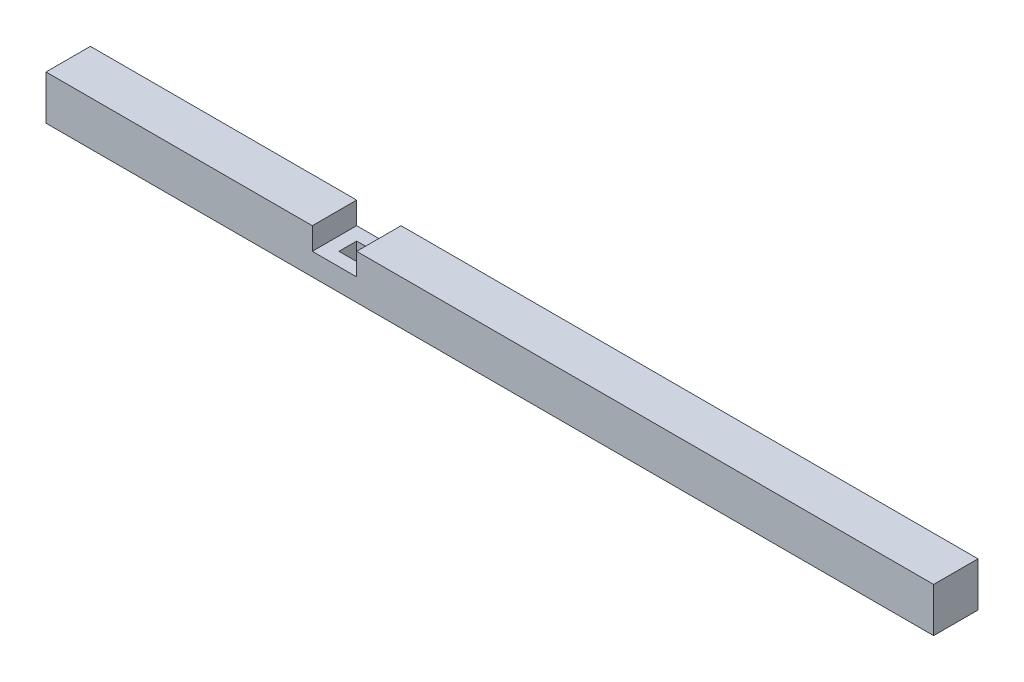
ISO-10303-21;
HEADER;
FILE_DESCRIPTION(('STEP AP214'),'2;1');
FILE_NAME('part.step','',(''),(''),'','','');
FILE_SCHEMA(('AUTOMOTIVE_DESIGN { 1 0 10303 214 1 1 1 1 }'));
ENDSEC;
DATA;
#1=APPLICATION_CONTEXT('core data for automotive mechanical design processes');
#2=APPLICATION_PROTOCOL_DEFINITION('international standard','automotive_design',2000,#1);
#3=PRODUCT_CONTEXT('',#1,'mechanical');
#4=PRODUCT('Part','Part','',(#3));
#5=PRODUCT_RELATED_PRODUCT_CATEGORY('part','',(#4));
#6=PRODUCT_DEFINITION_FORMATION('','',#4);
#7=PRODUCT_DEFINITION_CONTEXT('part definition',#1,'design');
#8=PRODUCT_DEFINITION('design','',#6,#7);
#9=PRODUCT_DEFINITION_SHAPE('','',#8);
#10=(LENGTH_UNIT() NAMED_UNIT(*) SI_UNIT(.MILLI.,.METRE.));
#11=(NAMED_UNIT(*) PLANE_ANGLE_UNIT() SI_UNIT($,.RADIAN.));
#12=(NAMED_UNIT(*) SI_UNIT($,.STERADIAN.) SOLID_ANGLE_UNIT());
#13=UNCERTAINTY_MEASURE_WITH_UNIT(LENGTH_MEASURE(1.E-05),#10,'distance_accuracy_value','');
#14=(GEOMETRIC_REPRESENTATION_CONTEXT(3) GLOBAL_UNCERTAINTY_ASSIGNED_CONTEXT((#13)) GLOBAL_UNIT_ASSIGNED_CONTEXT((#10,
#11,#12)) REPRESENTATION_CONTEXT('',''));
#15=CARTESIAN_POINT('',(0.,0.,0.));
#16=DIRECTION('',(0.,0.,1.));
#17=DIRECTION('',(1.,0.,0.));
#18=AXIS2_PLACEMENT_3D('',#15,#16,#17);
#19=CARTESIAN_POINT('',(500.,25.,0.));
#20=DIRECTION('',(0.,-1.,0.));
#21=DIRECTION('',(0.,0.,-1.));
#22=AXIS2_PLACEMENT_3D('',#19,#20,#21);
#23=PLANE('',#22);
#24=DIRECTION('',(-1.,0.,0.));
#25=VECTOR('',#24,1.);
#26=CARTESIAN_POINT('',(500.,25.,0.));
#27=LINE('',#26,#25);
#28=CARTESIAN_POINT('',(150.,25.,0.));
#29=VERTEX_POINT('',#28);
#30=CARTESIAN_POINT('',(0.,25.,0.));
#31=VERTEX_POINT('',#30);
#32=EDGE_CURVE('E202',#29,#31,#27,.T.);
#33=ORIENTED_EDGE('',*,*,#32,.F.);
#34=DIRECTION('',(0.,0.,1.));
#35=VECTOR('',#34,1.);
#36=CARTESIAN_POINT('',(150.,25.,-25.));
#37=LINE('',#36,#35);
#38=CARTESIAN_POINT('',(150.,25.,-25.));
#39=VERTEX_POINT('',#38);
#40=EDGE_CURVE('E183',#39,#29,#37,.T.);
#41=ORIENTED_EDGE('',*,*,#40,.F.);
#42=DIRECTION('',(-1.,0.,0.));
#43=VECTOR('',#42,1.);
#44=CARTESIAN_POINT('',(500.,25.,-25.));
#45=LINE('',#44,#43);
#46=CARTESIAN_POINT('',(0.,25.,-25.));
#47=VERTEX_POINT('',#46);
#48=EDGE_CURVE('E215',#39,#47,#45,.T.);
#49=ORIENTED_EDGE('',*,*,#48,.T.);
#50=DIRECTION('',(0.,0.,1.));
#51=VECTOR('',#50,1.);
#52=CARTESIAN_POINT('',(0.,25.,0.));
#53=LINE('',#52,#51);
#54=EDGE_CURVE('E196',#47,#31,#53,.T.);
#55=ORIENTED_EDGE('',*,*,#54,.T.);
#56=EDGE_LOOP('',(#33,#41,#49,#55));
#57=FACE_BOUND('',#56,.T.);
#58=ADVANCED_FACE('F40',(#57),#23,.F.);
#59=CARTESIAN_POINT('',(500.,0.,0.));
#60=DIRECTION('',(0.,0.,-1.));
#61=DIRECTION('',(-1.,0.,0.));
#62=AXIS2_PLACEMENT_3D('',#59,#60,#61);
#63=PLANE('',#62);
#64=DIRECTION('',(1.,0.,0.));
#65=VECTOR('',#64,1.);
#66=CARTESIAN_POINT('',(150.,12.5,0.));
#67=LINE('',#66,#65);
#68=CARTESIAN_POINT('',(150.,12.5,0.));
#69=VERTEX_POINT('',#68);
#70=CARTESIAN_POINT('',(175.,12.5,0.));
#71=VERTEX_POINT('',#70);
#72=EDGE_CURVE('E179',#69,#71,#67,.T.);
#73=ORIENTED_EDGE('',*,*,#72,.F.);
#74=DIRECTION('',(0.,-1.,0.));
#75=VECTOR('',#74,1.);
#76=CARTESIAN_POINT('',(150.,25.,0.));
#77=LINE('',#76,#75);
#78=EDGE_CURVE('E162',#29,#69,#77,.T.);
#79=ORIENTED_EDGE('',*,*,#78,.F.);
#80=ORIENTED_EDGE('',*,*,#32,.T.);
#81=DIRECTION('',(0.,-1.,0.));
#82=VECTOR('',#81,1.);
#83=CARTESIAN_POINT('',(0.,0.,0.));
#84=LINE('',#83,#82);
#85=CARTESIAN_POINT('',(0.,0.,0.));
#86=VERTEX_POINT('',#85);
#87=EDGE_CURVE('E185',#31,#86,#84,.T.);
#88=ORIENTED_EDGE('',*,*,#87,.T.);
#89=DIRECTION('',(-1.,0.,0.));
#90=VECTOR('',#89,1.);
#91=CARTESIAN_POINT('',(500.,0.,0.));
#92=LINE('',#91,#90);
#93=CARTESIAN_POINT('',(500.,0.,0.));
#94=VERTEX_POINT('',#93);
#95=EDGE_CURVE('E11',#94,#86,#92,.T.);
#96=ORIENTED_EDGE('',*,*,#95,.F.);
#97=DIRECTION('',(0.,-1.,0.));
#98=VECTOR('',#97,1.);
#99=CARTESIAN_POINT('',(500.,0.,0.));
#100=LINE('',#99,#98);
#101=CARTESIAN_POINT('',(500.,25.,0.));
#102=VERTEX_POINT('',#101);
#103=EDGE_CURVE('E192',#102,#94,#100,.T.);
#104=ORIENTED_EDGE('',*,*,#103,.F.);
#105=CARTESIAN_POINT('',(175.,25.,0.));
#106=VERTEX_POINT('',#105);
#107=EDGE_CURVE('E212',#102,#106,#27,.T.);
#108=ORIENTED_EDGE('',*,*,#107,.T.);
#109=DIRECTION('',(0.,1.,0.));
#110=VECTOR('',#109,1.);
#111=CARTESIAN_POINT('',(175.,25.,0.));
#112=LINE('',#111,#110);
#113=EDGE_CURVE('E170',#71,#106,#112,.T.);
#114=ORIENTED_EDGE('',*,*,#113,.F.);
#115=EDGE_LOOP('',(#73,#79,#80,#88,#96,#104,#108,#114));
#116=FACE_BOUND('',#115,.T.);
#117=ADVANCED_FACE('F42',(#116),#63,.F.);
#118=CARTESIAN_POINT('',(500.,0.,0.));
#119=DIRECTION('',(0.,1.,0.));
#120=DIRECTION('',(0.,0.,1.));
#121=AXIS2_PLACEMENT_3D('',#118,#119,#120);
#122=PLANE('',#121);
#123=DIRECTION('',(1.,0.,0.));
#124=VECTOR('',#123,1.);
#125=CARTESIAN_POINT('',(157.5,0.,-7.50000000000001));
#126=LINE('',#125,#124);
#127=CARTESIAN_POINT('',(157.5,0.,-7.50000000000001));
#128=VERTEX_POINT('',#127);
#129=CARTESIAN_POINT('',(167.5,0.,-7.50000000000001));
#130=VERTEX_POINT('',#129);
#131=EDGE_CURVE('E137',#128,#130,#126,.T.);
#132=ORIENTED_EDGE('',*,*,#131,.T.);
#133=DIRECTION('',(0.,0.,-1.));
#134=VECTOR('',#133,1.);
#135=CARTESIAN_POINT('',(167.5,0.,-7.50000000000001));
#136=LINE('',#135,#134);
#137=CARTESIAN_POINT('',(167.5,0.,-17.5));
#138=VERTEX_POINT('',#137);
#139=EDGE_CURVE('E131',#130,#138,#136,.T.);
#140=ORIENTED_EDGE('',*,*,#139,.T.);
#141=DIRECTION('',(-1.,0.,0.));
#142=VECTOR('',#141,1.);
#143=CARTESIAN_POINT('',(157.5,0.,-17.5));
#144=LINE('',#143,#142);
#145=CARTESIAN_POINT('',(157.5,0.,-17.5));
#146=VERTEX_POINT('',#145);
#147=EDGE_CURVE('E140',#138,#146,#144,.T.);
#148=ORIENTED_EDGE('',*,*,#147,.T.);
#149=DIRECTION('',(0.,0.,1.));
#150=VECTOR('',#149,1.);
#151=CARTESIAN_POINT('',(157.5,0.,-7.50000000000001));
#152=LINE('',#151,#150);
#153=EDGE_CURVE('E55',#146,#128,#152,.T.);
#154=ORIENTED_EDGE('',*,*,#153,.T.);
#155=EDGE_LOOP('',(#132,#140,#148,#154));
#156=FACE_BOUND('',#155,.T.);
#157=DIRECTION('',(0.,0.,-1.));
#158=VECTOR('',#157,1.);
#159=CARTESIAN_POINT('',(0.,0.,0.));
#160=LINE('',#159,#158);
#161=CARTESIAN_POINT('',(0.,0.,-25.));
#162=VERTEX_POINT('',#161);
#163=EDGE_CURVE('E205',#86,#162,#160,.T.);
#164=ORIENTED_EDGE('',*,*,#163,.T.);
#165=DIRECTION('',(-1.,0.,0.));
#166=VECTOR('',#165,1.);
#167=CARTESIAN_POINT('',(500.,0.,-25.));
#168=LINE('',#167,#166);
#169=CARTESIAN_POINT('',(500.,0.,-25.));
#170=VERTEX_POINT('',#169);
#171=EDGE_CURVE('E48',#170,#162,#168,.T.);
#172=ORIENTED_EDGE('',*,*,#171,.F.);
#173=DIRECTION('',(0.,0.,-1.));
#174=VECTOR('',#173,1.);
#175=CARTESIAN_POINT('',(500.,0.,0.));
#176=LINE('',#175,#174);
#177=EDGE_CURVE('E195',#94,#170,#176,.T.);
#178=ORIENTED_EDGE('',*,*,#177,.F.);
#179=ORIENTED_EDGE('',*,*,#95,.T.);
#180=EDGE_LOOP('',(#164,#172,#178,#179));
#181=FACE_BOUND('',#180,.T.);
#182=ADVANCED_FACE('F144',(#156,#181),#122,.F.);
#183=CARTESIAN_POINT('',(500.,0.,-25.));
#184=DIRECTION('',(0.,0.,1.));
#185=DIRECTION('',(1.,0.,0.));
#186=AXIS2_PLACEMENT_3D('',#183,#184,#185);
#187=PLANE('',#186);
#188=ORIENTED_EDGE('',*,*,#48,.F.);
#189=DIRECTION('',(0.,-1.,0.));
#190=VECTOR('',#189,1.);
#191=CARTESIAN_POINT('',(150.,25.,-25.));
#192=LINE('',#191,#190);
#193=CARTESIAN_POINT('',(150.,12.5,-25.));
#194=VERTEX_POINT('',#193);
#195=EDGE_CURVE('E166',#39,#194,#192,.T.);
#196=ORIENTED_EDGE('',*,*,#195,.T.);
#197=DIRECTION('',(1.,0.,0.));
#198=VECTOR('',#197,1.);
#199=CARTESIAN_POINT('',(150.,12.5,-25.));
#200=LINE('',#199,#198);
#201=CARTESIAN_POINT('',(175.,12.5,-25.));
#202=VERTEX_POINT('',#201);
#203=EDGE_CURVE('E169',#194,#202,#200,.T.);
#204=ORIENTED_EDGE('',*,*,#203,.T.);
#205=DIRECTION('',(0.,1.,0.));
#206=VECTOR('',#205,1.);
#207=CARTESIAN_POINT('',(175.,25.,-25.));
#208=LINE('',#207,#206);
#209=CARTESIAN_POINT('',(175.,25.,-25.));
#210=VERTEX_POINT('',#209);
#211=EDGE_CURVE('E173',#202,#210,#208,.T.);
#212=ORIENTED_EDGE('',*,*,#211,.T.);
#213=CARTESIAN_POINT('',(500.,25.,-25.));
#214=VERTEX_POINT('',#213);
#215=EDGE_CURVE('E216',#214,#210,#45,.T.);
#216=ORIENTED_EDGE('',*,*,#215,.F.);
#217=DIRECTION('',(0.,1.,0.));
#218=VECTOR('',#217,1.);
#219=CARTESIAN_POINT('',(500.,0.,-25.));
#220=LINE('',#219,#218);
#221=EDGE_CURVE('E198',#170,#214,#220,.T.);
#222=ORIENTED_EDGE('',*,*,#221,.F.);
#223=ORIENTED_EDGE('',*,*,#171,.T.);
#224=DIRECTION('',(0.,1.,0.));
#225=VECTOR('',#224,1.);
#226=CARTESIAN_POINT('',(0.,0.,-25.));
#227=LINE('',#226,#225);
#228=EDGE_CURVE('E207',#162,#47,#227,.T.);
#229=ORIENTED_EDGE('',*,*,#228,.T.);
#230=EDGE_LOOP('',(#188,#196,#204,#212,#216,#222,#223,#229));
#231=FACE_BOUND('',#230,.T.);
#232=ADVANCED_FACE('F224',(#231),#187,.F.);
#233=ORIENTED_EDGE('',*,*,#215,.T.);
#234=DIRECTION('',(0.,0.,1.));
#235=VECTOR('',#234,1.);
#236=CARTESIAN_POINT('',(175.,25.,-25.));
#237=LINE('',#236,#235);
#238=EDGE_CURVE('E186',#210,#106,#237,.T.);
#239=ORIENTED_EDGE('',*,*,#238,.T.);
#240=ORIENTED_EDGE('',*,*,#107,.F.);
#241=DIRECTION('',(0.,0.,1.));
#242=VECTOR('',#241,1.);
#243=CARTESIAN_POINT('',(500.,25.,0.));
#244=LINE('',#243,#242);
#245=EDGE_CURVE('E200',#214,#102,#244,.T.);
#246=ORIENTED_EDGE('',*,*,#245,.F.);
#247=EDGE_LOOP('',(#233,#239,#240,#246));
#248=FACE_BOUND('',#247,.T.);
#249=ADVANCED_FACE('F246',(#248),#23,.F.);
#250=CARTESIAN_POINT('',(500.,0.,0.));
#251=DIRECTION('',(-1.,0.,0.));
#252=DIRECTION('',(0.,0.,1.));
#253=AXIS2_PLACEMENT_3D('',#250,#251,#252);
#254=PLANE('',#253);
#255=ORIENTED_EDGE('',*,*,#103,.T.);
#256=ORIENTED_EDGE('',*,*,#177,.T.);
#257=ORIENTED_EDGE('',*,*,#221,.T.);
#258=ORIENTED_EDGE('',*,*,#245,.T.);
#259=EDGE_LOOP('',(#255,#256,#257,#258));
#260=FACE_BOUND('',#259,.T.);
#261=ADVANCED_FACE('F250',(#260),#254,.F.);
#262=CARTESIAN_POINT('',(0.,0.,0.));
#263=DIRECTION('',(-1.,0.,0.));
#264=DIRECTION('',(0.,0.,1.));
#265=AXIS2_PLACEMENT_3D('',#262,#263,#264);
#266=PLANE('',#265);
#267=ORIENTED_EDGE('',*,*,#87,.F.);
#268=ORIENTED_EDGE('',*,*,#54,.F.);
#269=ORIENTED_EDGE('',*,*,#228,.F.);
#270=ORIENTED_EDGE('',*,*,#163,.F.);
#271=EDGE_LOOP('',(#267,#268,#269,#270));
#272=FACE_BOUND('',#271,.T.);
#273=ADVANCED_FACE('F229',(#272),#266,.T.);
#274=CARTESIAN_POINT('',(150.,25.,-25.));
#275=DIRECTION('',(-1.,0.,0.));
#276=DIRECTION('',(0.,0.,1.));
#277=AXIS2_PLACEMENT_3D('',#274,#275,#276);
#278=PLANE('',#277);
#279=ORIENTED_EDGE('',*,*,#78,.T.);
#280=DIRECTION('',(0.,0.,1.));
#281=VECTOR('',#280,1.);
#282=CARTESIAN_POINT('',(150.,12.5,-25.));
#283=LINE('',#282,#281);
#284=EDGE_CURVE('E176',#194,#69,#283,.T.);
#285=ORIENTED_EDGE('',*,*,#284,.F.);
#286=ORIENTED_EDGE('',*,*,#195,.F.);
#287=ORIENTED_EDGE('',*,*,#40,.T.);
#288=EDGE_LOOP('',(#279,#285,#286,#287));
#289=FACE_BOUND('',#288,.T.);
#290=ADVANCED_FACE('F235',(#289),#278,.F.);
#291=CARTESIAN_POINT('',(175.,25.,-25.));
#292=DIRECTION('',(1.,0.,0.));
#293=DIRECTION('',(0.,0.,-1.));
#294=AXIS2_PLACEMENT_3D('',#291,#292,#293);
#295=PLANE('',#294);
#296=ORIENTED_EDGE('',*,*,#113,.T.);
#297=ORIENTED_EDGE('',*,*,#238,.F.);
#298=ORIENTED_EDGE('',*,*,#211,.F.);
#299=DIRECTION('',(0.,0.,1.));
#300=VECTOR('',#299,1.);
#301=CARTESIAN_POINT('',(175.,12.5,-25.));
#302=LINE('',#301,#300);
#303=EDGE_CURVE('E189',#202,#71,#302,.T.);
#304=ORIENTED_EDGE('',*,*,#303,.T.);
#305=EDGE_LOOP('',(#296,#297,#298,#304));
#306=FACE_BOUND('',#305,.T.);
#307=ADVANCED_FACE('F243',(#306),#295,.F.);
#308=CARTESIAN_POINT('',(150.,12.5,-25.));
#309=DIRECTION('',(0.,-1.,0.));
#310=DIRECTION('',(0.,0.,-1.));
#311=AXIS2_PLACEMENT_3D('',#308,#309,#310);
#312=PLANE('',#311);
#313=DIRECTION('',(-1.,0.,0.));
#314=VECTOR('',#313,1.);
#315=CARTESIAN_POINT('',(157.5,12.5,-17.5));
#316=LINE('',#315,#314);
#317=CARTESIAN_POINT('',(167.5,12.5,-17.5));
#318=VERTEX_POINT('',#317);
#319=CARTESIAN_POINT('',(157.5,12.5,-17.5));
#320=VERTEX_POINT('',#319);
#321=EDGE_CURVE('E156',#318,#320,#316,.T.);
#322=ORIENTED_EDGE('',*,*,#321,.F.);
#323=DIRECTION('',(0.,0.,-1.));
#324=VECTOR('',#323,1.);
#325=CARTESIAN_POINT('',(167.5,12.5,-7.50000000000001));
#326=LINE('',#325,#324);
#327=CARTESIAN_POINT('',(167.5,12.5,-7.50000000000001));
#328=VERTEX_POINT('',#327);
#329=EDGE_CURVE('E63',#328,#318,#326,.T.);
#330=ORIENTED_EDGE('',*,*,#329,.F.);
#331=DIRECTION('',(1.,0.,0.));
#332=VECTOR('',#331,1.);
#333=CARTESIAN_POINT('',(157.5,12.5,-7.50000000000001));
#334=LINE('',#333,#332);
#335=CARTESIAN_POINT('',(157.5,12.5,-7.50000000000001));
#336=VERTEX_POINT('',#335);
#337=EDGE_CURVE('E147',#336,#328,#334,.T.);
#338=ORIENTED_EDGE('',*,*,#337,.F.);
#339=DIRECTION('',(0.,0.,1.));
#340=VECTOR('',#339,1.);
#341=CARTESIAN_POINT('',(157.5,12.5,-7.50000000000001));
#342=LINE('',#341,#340);
#343=EDGE_CURVE('E150',#320,#336,#342,.T.);
#344=ORIENTED_EDGE('',*,*,#343,.F.);
#345=EDGE_LOOP('',(#322,#330,#338,#344));
#346=FACE_BOUND('',#345,.T.);
#347=ORIENTED_EDGE('',*,*,#72,.T.);
#348=ORIENTED_EDGE('',*,*,#303,.F.);
#349=ORIENTED_EDGE('',*,*,#203,.F.);
#350=ORIENTED_EDGE('',*,*,#284,.T.);
#351=EDGE_LOOP('',(#347,#348,#349,#350));
#352=FACE_BOUND('',#351,.T.);
#353=ADVANCED_FACE('F239',(#346,#352),#312,.F.);
#354=CARTESIAN_POINT('',(167.5,0.,-7.50000000000001));
#355=DIRECTION('',(1.,0.,0.));
#356=DIRECTION('',(0.,0.,-1.));
#357=AXIS2_PLACEMENT_3D('',#354,#355,#356);
#358=PLANE('',#357);
#359=ORIENTED_EDGE('',*,*,#329,.T.);
#360=DIRECTION('',(0.,1.,0.));
#361=VECTOR('',#360,1.);
#362=CARTESIAN_POINT('',(167.5,0.,-17.5));
#363=LINE('',#362,#361);
#364=EDGE_CURVE('E127',#138,#318,#363,.T.);
#365=ORIENTED_EDGE('',*,*,#364,.F.);
#366=ORIENTED_EDGE('',*,*,#139,.F.);
#367=DIRECTION('',(0.,1.,0.));
#368=VECTOR('',#367,1.);
#369=CARTESIAN_POINT('',(167.5,0.,-7.50000000000001));
#370=LINE('',#369,#368);
#371=EDGE_CURVE('E160',#130,#328,#370,.T.);
#372=ORIENTED_EDGE('',*,*,#371,.T.);
#373=EDGE_LOOP('',(#359,#365,#366,#372));
#374=FACE_BOUND('',#373,.T.);
#375=ADVANCED_FACE('F129',(#374),#358,.F.);
#376=CARTESIAN_POINT('',(157.5,0.,-7.50000000000001));
#377=DIRECTION('',(0.,0.,1.));
#378=DIRECTION('',(1.,0.,0.));
#379=AXIS2_PLACEMENT_3D('',#376,#377,#378);
#380=PLANE('',#379);
#381=ORIENTED_EDGE('',*,*,#337,.T.);
#382=ORIENTED_EDGE('',*,*,#371,.F.);
#383=ORIENTED_EDGE('',*,*,#131,.F.);
#384=DIRECTION('',(0.,1.,0.));
#385=VECTOR('',#384,1.);
#386=CARTESIAN_POINT('',(157.5,0.,-7.50000000000001));
#387=LINE('',#386,#385);
#388=EDGE_CURVE('E163',#128,#336,#387,.T.);
#389=ORIENTED_EDGE('',*,*,#388,.T.);
#390=EDGE_LOOP('',(#381,#382,#383,#389));
#391=FACE_BOUND('',#390,.T.);
#392=ADVANCED_FACE('F301',(#391),#380,.F.);
#393=CARTESIAN_POINT('',(157.5,0.,-7.50000000000001));
#394=DIRECTION('',(-1.,0.,0.));
#395=DIRECTION('',(0.,0.,1.));
#396=AXIS2_PLACEMENT_3D('',#393,#394,#395);
#397=PLANE('',#396);
#398=ORIENTED_EDGE('',*,*,#343,.T.);
#399=ORIENTED_EDGE('',*,*,#388,.F.);
#400=ORIENTED_EDGE('',*,*,#153,.F.);
#401=DIRECTION('',(0.,1.,0.));
#402=VECTOR('',#401,1.);
#403=CARTESIAN_POINT('',(157.5,0.,-17.5));
#404=LINE('',#403,#402);
#405=EDGE_CURVE('E136',#146,#320,#404,.T.);
#406=ORIENTED_EDGE('',*,*,#405,.T.);
#407=EDGE_LOOP('',(#398,#399,#400,#406));
#408=FACE_BOUND('',#407,.T.);
#409=ADVANCED_FACE('F310',(#408),#397,.F.);
#410=CARTESIAN_POINT('',(157.5,0.,-17.5));
#411=DIRECTION('',(0.,0.,-1.));
#412=DIRECTION('',(-1.,0.,0.));
#413=AXIS2_PLACEMENT_3D('',#410,#411,#412);
#414=PLANE('',#413);
#415=ORIENTED_EDGE('',*,*,#321,.T.);
#416=ORIENTED_EDGE('',*,*,#405,.F.);
#417=ORIENTED_EDGE('',*,*,#147,.F.);
#418=ORIENTED_EDGE('',*,*,#364,.T.);
#419=EDGE_LOOP('',(#415,#416,#417,#418));
#420=FACE_BOUND('',#419,.T.);
#421=ADVANCED_FACE('F141',(#420),#414,.F.);
#422=CLOSED_SHELL('',(#58,#117,#182,#232,#249,#261,#273,#290,#307,#353,#375,#392,#409,#421));
#423=MANIFOLD_SOLID_BREP('B2',#422);
#424=ADVANCED_BREP_SHAPE_REPRESENTATION('',(#18,#423),#14);
#425=SHAPE_DEFINITION_REPRESENTATION(#9,#424);
ENDSEC;
END-ISO-10303-21;
